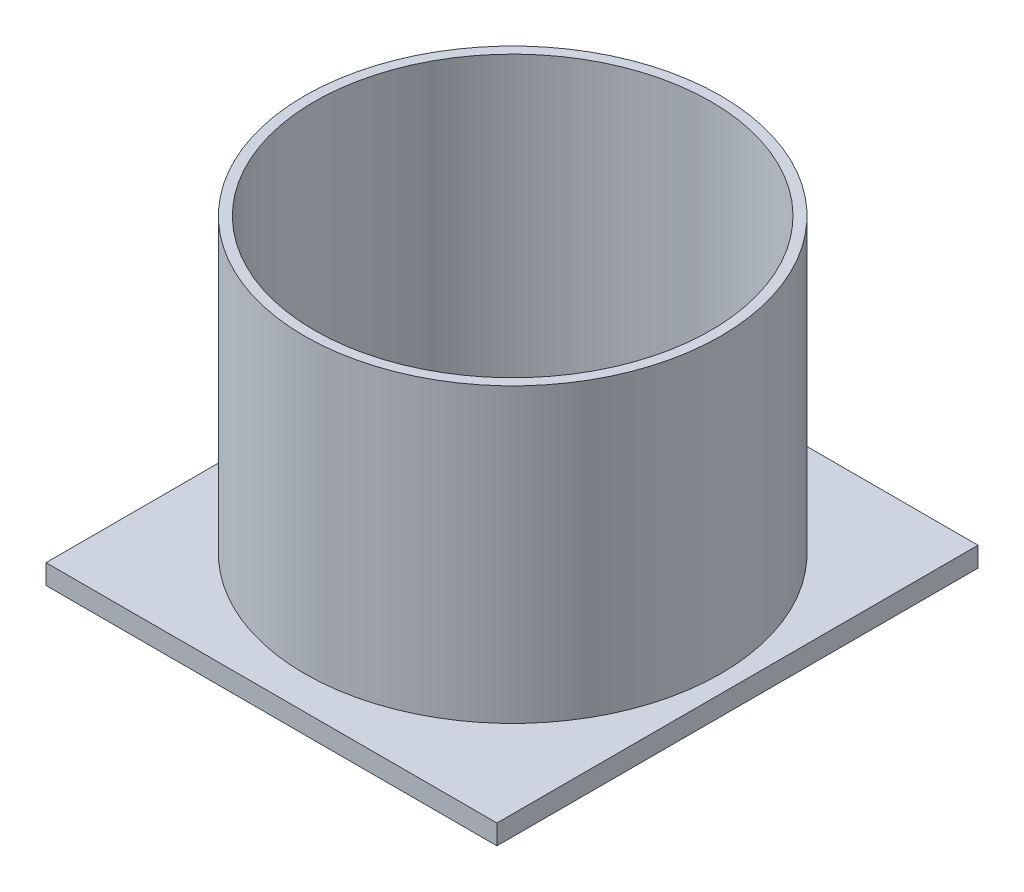
ISO-10303-21;
HEADER;
FILE_DESCRIPTION(('STEP AP214'),'2;1');
FILE_NAME('part.step','',(''),(''),'','','');
FILE_SCHEMA(('AUTOMOTIVE_DESIGN { 1 0 10303 214 1 1 1 1 }'));
ENDSEC;
DATA;
#1=APPLICATION_CONTEXT('core data for automotive mechanical design processes');
#2=APPLICATION_PROTOCOL_DEFINITION('international standard','automotive_design',2000,#1);
#3=PRODUCT_CONTEXT('',#1,'mechanical');
#4=PRODUCT('Part','Part','',(#3));
#5=PRODUCT_RELATED_PRODUCT_CATEGORY('part','',(#4));
#6=PRODUCT_DEFINITION_FORMATION('','',#4);
#7=PRODUCT_DEFINITION_CONTEXT('part definition',#1,'design');
#8=PRODUCT_DEFINITION('design','',#6,#7);
#9=PRODUCT_DEFINITION_SHAPE('','',#8);
#10=(LENGTH_UNIT() NAMED_UNIT(*) SI_UNIT(.MILLI.,.METRE.));
#11=(NAMED_UNIT(*) PLANE_ANGLE_UNIT() SI_UNIT($,.RADIAN.));
#12=(NAMED_UNIT(*) SI_UNIT($,.STERADIAN.) SOLID_ANGLE_UNIT());
#13=UNCERTAINTY_MEASURE_WITH_UNIT(LENGTH_MEASURE(1.E-05),#10,'distance_accuracy_value','');
#14=(GEOMETRIC_REPRESENTATION_CONTEXT(3) GLOBAL_UNCERTAINTY_ASSIGNED_CONTEXT((#13)) GLOBAL_UNIT_ASSIGNED_CONTEXT((#10,
#11,#12)) REPRESENTATION_CONTEXT('',''));
#15=CARTESIAN_POINT('',(0.,0.,0.));
#16=DIRECTION('',(0.,0.,1.));
#17=DIRECTION('',(1.,0.,0.));
#18=AXIS2_PLACEMENT_3D('',#15,#16,#17);
#19=CARTESIAN_POINT('',(0.,1.5,-44.4));
#20=DIRECTION('',(1.,0.,0.));
#21=DIRECTION('',(0.,0.,-1.));
#22=AXIS2_PLACEMENT_3D('',#19,#20,#21);
#23=PLANE('',#22);
#24=DIRECTION('',(0.,0.,1.));
#25=VECTOR('',#24,1.);
#26=CARTESIAN_POINT('',(0.,1.5,-44.4));
#27=LINE('',#26,#25);
#28=CARTESIAN_POINT('',(0.,1.5,-18.96928800417));
#29=VERTEX_POINT('',#28);
#30=CARTESIAN_POINT('',(0.,1.5,0.));
#31=VERTEX_POINT('',#30);
#32=EDGE_CURVE('E155',#29,#31,#27,.T.);
#33=ORIENTED_EDGE('',*,*,#32,.F.);
#34=DIRECTION('',(0.,-1.,0.));
#35=VECTOR('',#34,1.);
#36=CARTESIAN_POINT('',(0.,33.,-18.96928800417));
#37=LINE('',#36,#35);
#38=CARTESIAN_POINT('',(0.,0.,-18.96928800417));
#39=VERTEX_POINT('',#38);
#40=EDGE_CURVE('E58',#29,#39,#37,.T.);
#41=ORIENTED_EDGE('',*,*,#40,.T.);
#42=DIRECTION('',(0.,0.,1.));
#43=VECTOR('',#42,1.);
#44=CARTESIAN_POINT('',(0.,0.,-44.4));
#45=LINE('',#44,#43);
#46=CARTESIAN_POINT('',(0.,0.,0.));
#47=VERTEX_POINT('',#46);
#48=EDGE_CURVE('E174',#39,#47,#45,.T.);
#49=ORIENTED_EDGE('',*,*,#48,.T.);
#50=DIRECTION('',(0.,-1.,0.));
#51=VECTOR('',#50,1.);
#52=CARTESIAN_POINT('',(0.,1.5,0.));
#53=LINE('',#52,#51);
#54=EDGE_CURVE('E43',#31,#47,#53,.T.);
#55=ORIENTED_EDGE('',*,*,#54,.F.);
#56=EDGE_LOOP('',(#33,#41,#49,#55));
#57=FACE_BOUND('',#56,.T.);
#58=ADVANCED_FACE('F35',(#57),#23,.F.);
#59=CARTESIAN_POINT('',(41.5,1.5,0.));
#60=DIRECTION('',(-1.,0.,0.));
#61=DIRECTION('',(0.,0.,1.));
#62=AXIS2_PLACEMENT_3D('',#59,#60,#61);
#63=PLANE('',#62);
#64=DIRECTION('',(0.,0.,-1.));
#65=VECTOR('',#64,1.);
#66=CARTESIAN_POINT('',(41.5,1.5,0.));
#67=LINE('',#66,#65);
#68=CARTESIAN_POINT('',(41.5,1.5,-25.43071199583));
#69=VERTEX_POINT('',#68);
#70=CARTESIAN_POINT('',(41.5,1.5,-44.4));
#71=VERTEX_POINT('',#70);
#72=EDGE_CURVE('E139',#69,#71,#67,.T.);
#73=ORIENTED_EDGE('',*,*,#72,.F.);
#74=DIRECTION('',(0.,-1.,0.));
#75=VECTOR('',#74,1.);
#76=CARTESIAN_POINT('',(41.5,33.,-25.43071199583));
#77=LINE('',#76,#75);
#78=CARTESIAN_POINT('',(41.5,0.,-25.43071199583));
#79=VERTEX_POINT('',#78);
#80=EDGE_CURVE('E50',#69,#79,#77,.T.);
#81=ORIENTED_EDGE('',*,*,#80,.T.);
#82=DIRECTION('',(0.,0.,-1.));
#83=VECTOR('',#82,1.);
#84=CARTESIAN_POINT('',(41.5,0.,0.));
#85=LINE('',#84,#83);
#86=CARTESIAN_POINT('',(41.5,0.,-44.4));
#87=VERTEX_POINT('',#86);
#88=EDGE_CURVE('E137',#79,#87,#85,.T.);
#89=ORIENTED_EDGE('',*,*,#88,.T.);
#90=DIRECTION('',(0.,-1.,0.));
#91=VECTOR('',#90,1.);
#92=CARTESIAN_POINT('',(41.5,1.5,-44.4));
#93=LINE('',#92,#91);
#94=EDGE_CURVE('E159',#71,#87,#93,.T.);
#95=ORIENTED_EDGE('',*,*,#94,.F.);
#96=EDGE_LOOP('',(#73,#81,#89,#95));
#97=FACE_BOUND('',#96,.T.);
#98=ADVANCED_FACE('F135',(#97),#63,.F.);
#99=CARTESIAN_POINT('',(0.,0.,-44.4));
#100=VERTEX_POINT('',#99);
#101=CARTESIAN_POINT('',(0.,0.,-25.43071199583));
#102=VERTEX_POINT('',#101);
#103=EDGE_CURVE('E150',#100,#102,#45,.T.);
#104=ORIENTED_EDGE('',*,*,#103,.T.);
#105=DIRECTION('',(0.,-1.,0.));
#106=VECTOR('',#105,1.);
#107=CARTESIAN_POINT('',(0.,33.,-25.43071199583));
#108=LINE('',#107,#106);
#109=CARTESIAN_POINT('',(0.,1.5,-25.43071199583));
#110=VERTEX_POINT('',#109);
#111=EDGE_CURVE('E195',#102,#110,#108,.F.);
#112=ORIENTED_EDGE('',*,*,#111,.T.);
#113=CARTESIAN_POINT('',(0.,1.5,-44.4));
#114=VERTEX_POINT('',#113);
#115=EDGE_CURVE('E185',#114,#110,#27,.T.);
#116=ORIENTED_EDGE('',*,*,#115,.F.);
#117=DIRECTION('',(0.,-1.,0.));
#118=VECTOR('',#117,1.);
#119=CARTESIAN_POINT('',(0.,1.5,-44.4));
#120=LINE('',#119,#118);
#121=EDGE_CURVE('E156',#114,#100,#120,.T.);
#122=ORIENTED_EDGE('',*,*,#121,.T.);
#123=EDGE_LOOP('',(#104,#112,#116,#122));
#124=FACE_BOUND('',#123,.T.);
#125=ADVANCED_FACE('F37',(#124),#23,.F.);
#126=CARTESIAN_POINT('',(0.,1.5,0.));
#127=DIRECTION('',(0.,0.,-1.));
#128=DIRECTION('',(-1.,0.,0.));
#129=AXIS2_PLACEMENT_3D('',#126,#127,#128);
#130=PLANE('',#129);
#131=DIRECTION('',(1.,0.,0.));
#132=VECTOR('',#131,1.);
#133=CARTESIAN_POINT('',(0.,0.,0.));
#134=LINE('',#133,#132);
#135=CARTESIAN_POINT('',(41.5,0.,0.));
#136=VERTEX_POINT('',#135);
#137=EDGE_CURVE('E148',#47,#136,#134,.T.);
#138=ORIENTED_EDGE('',*,*,#137,.T.);
#139=DIRECTION('',(0.,-1.,0.));
#140=VECTOR('',#139,1.);
#141=CARTESIAN_POINT('',(41.5,1.5,0.));
#142=LINE('',#141,#140);
#143=CARTESIAN_POINT('',(41.5,1.5,0.));
#144=VERTEX_POINT('',#143);
#145=EDGE_CURVE('E162',#144,#136,#142,.T.);
#146=ORIENTED_EDGE('',*,*,#145,.F.);
#147=DIRECTION('',(1.,0.,0.));
#148=VECTOR('',#147,1.);
#149=CARTESIAN_POINT('',(0.,1.5,0.));
#150=LINE('',#149,#148);
#151=EDGE_CURVE('E171',#31,#144,#150,.T.);
#152=ORIENTED_EDGE('',*,*,#151,.F.);
#153=ORIENTED_EDGE('',*,*,#54,.T.);
#154=EDGE_LOOP('',(#138,#146,#152,#153));
#155=FACE_BOUND('',#154,.T.);
#156=ADVANCED_FACE('F168',(#155),#130,.F.);
#157=CARTESIAN_POINT('',(41.5,0.,-18.96928800417));
#158=VERTEX_POINT('',#157);
#159=EDGE_CURVE('E147',#136,#158,#85,.T.);
#160=ORIENTED_EDGE('',*,*,#159,.T.);
#161=DIRECTION('',(0.,-1.,0.));
#162=VECTOR('',#161,1.);
#163=CARTESIAN_POINT('',(41.5,33.,-18.96928800417));
#164=LINE('',#163,#162);
#165=CARTESIAN_POINT('',(41.5,1.5,-18.96928800417));
#166=VERTEX_POINT('',#165);
#167=EDGE_CURVE('E125',#158,#166,#164,.F.);
#168=ORIENTED_EDGE('',*,*,#167,.T.);
#169=EDGE_CURVE('E181',#144,#166,#67,.T.);
#170=ORIENTED_EDGE('',*,*,#169,.F.);
#171=ORIENTED_EDGE('',*,*,#145,.T.);
#172=EDGE_LOOP('',(#160,#168,#170,#171));
#173=FACE_BOUND('',#172,.T.);
#174=ADVANCED_FACE('F178',(#173),#63,.F.);
#175=CARTESIAN_POINT('',(41.5,1.5,-44.4));
#176=DIRECTION('',(0.,0.,1.));
#177=DIRECTION('',(1.,0.,0.));
#178=AXIS2_PLACEMENT_3D('',#175,#176,#177);
#179=PLANE('',#178);
#180=DIRECTION('',(-1.,0.,0.));
#181=VECTOR('',#180,1.);
#182=CARTESIAN_POINT('',(41.5,0.,-44.4));
#183=LINE('',#182,#181);
#184=EDGE_CURVE('E146',#87,#100,#183,.T.);
#185=ORIENTED_EDGE('',*,*,#184,.T.);
#186=ORIENTED_EDGE('',*,*,#121,.F.);
#187=DIRECTION('',(-1.,0.,0.));
#188=VECTOR('',#187,1.);
#189=CARTESIAN_POINT('',(41.5,1.5,-44.4));
#190=LINE('',#189,#188);
#191=EDGE_CURVE('E160',#71,#114,#190,.T.);
#192=ORIENTED_EDGE('',*,*,#191,.F.);
#193=ORIENTED_EDGE('',*,*,#94,.T.);
#194=EDGE_LOOP('',(#185,#186,#192,#193));
#195=FACE_BOUND('',#194,.T.);
#196=ADVANCED_FACE('F284',(#195),#179,.F.);
#197=CARTESIAN_POINT('',(0.,0.,0.));
#198=DIRECTION('',(0.,1.,0.));
#199=DIRECTION('',(0.,0.,1.));
#200=AXIS2_PLACEMENT_3D('',#197,#198,#199);
#201=PLANE('',#200);
#202=CARTESIAN_POINT('',(20.75,0.,-22.2));
#203=DIRECTION('',(0.,1.,0.));
#204=DIRECTION('',(0.,0.,1.));
#205=AXIS2_PLACEMENT_3D('',#202,#203,#204);
#206=CIRCLE('',#205,20.);
#207=CARTESIAN_POINT('',(20.75,0.,-2.20000000000001));
#208=VERTEX_POINT('',#207);
#209=EDGE_CURVE('E197',#208,#208,#206,.T.);
#210=ORIENTED_EDGE('',*,*,#209,.T.);
#211=EDGE_LOOP('',(#210));
#212=FACE_BOUND('',#211,.T.);
#213=ORIENTED_EDGE('',*,*,#48,.F.);
#214=CARTESIAN_POINT('',(20.75,0.,-22.2));
#215=DIRECTION('',(0.,-1.,0.));
#216=DIRECTION('',(0.,0.,-1.));
#217=AXIS2_PLACEMENT_3D('',#214,#215,#216);
#218=CIRCLE('',#217,21.);
#219=EDGE_CURVE('E131',#39,#102,#218,.T.);
#220=ORIENTED_EDGE('',*,*,#219,.T.);
#221=ORIENTED_EDGE('',*,*,#103,.F.);
#222=ORIENTED_EDGE('',*,*,#184,.F.);
#223=ORIENTED_EDGE('',*,*,#88,.F.);
#224=EDGE_CURVE('E122',#79,#158,#218,.T.);
#225=ORIENTED_EDGE('',*,*,#224,.T.);
#226=ORIENTED_EDGE('',*,*,#159,.F.);
#227=ORIENTED_EDGE('',*,*,#137,.F.);
#228=EDGE_LOOP('',(#213,#220,#221,#222,#223,#225,#226,#227));
#229=FACE_BOUND('',#228,.T.);
#230=ADVANCED_FACE('F144',(#212,#229),#201,.F.);
#231=CARTESIAN_POINT('',(0.,1.5,0.));
#232=DIRECTION('',(0.,1.,0.));
#233=DIRECTION('',(0.,0.,1.));
#234=AXIS2_PLACEMENT_3D('',#231,#232,#233);
#235=PLANE('',#234);
#236=DIRECTION('',(0.,0.,1.));
#237=VECTOR('',#236,1.);
#238=CARTESIAN_POINT('',(-2.,1.5,-46.4));
#239=LINE('',#238,#237);
#240=CARTESIAN_POINT('',(-2.,1.5,-46.4));
#241=VERTEX_POINT('',#240);
#242=CARTESIAN_POINT('',(-2.,1.5,2.13975903614458));
#243=VERTEX_POINT('',#242);
#244=EDGE_CURVE('E140',#241,#243,#239,.T.);
#245=ORIENTED_EDGE('',*,*,#244,.F.);
#246=DIRECTION('',(-1.,0.,0.));
#247=VECTOR('',#246,1.);
#248=CARTESIAN_POINT('',(43.5,1.5,-46.4));
#249=LINE('',#248,#247);
#250=CARTESIAN_POINT('',(43.5,1.5,-46.4));
#251=VERTEX_POINT('',#250);
#252=EDGE_CURVE('E214',#251,#241,#249,.T.);
#253=ORIENTED_EDGE('',*,*,#252,.F.);
#254=DIRECTION('',(0.,0.,-1.));
#255=VECTOR('',#254,1.);
#256=CARTESIAN_POINT('',(43.5,1.5,2.13975903614456));
#257=LINE('',#256,#255);
#258=CARTESIAN_POINT('',(43.5,1.5,2.13975903614456));
#259=VERTEX_POINT('',#258);
#260=EDGE_CURVE('E225',#259,#251,#257,.T.);
#261=ORIENTED_EDGE('',*,*,#260,.F.);
#262=DIRECTION('',(1.,0.,0.));
#263=VECTOR('',#262,1.);
#264=CARTESIAN_POINT('',(-2.,1.5,2.13975903614458));
#265=LINE('',#264,#263);
#266=EDGE_CURVE('E223',#243,#259,#265,.T.);
#267=ORIENTED_EDGE('',*,*,#266,.F.);
#268=EDGE_LOOP('',(#245,#253,#261,#267));
#269=FACE_BOUND('',#268,.T.);
#270=ORIENTED_EDGE('',*,*,#169,.T.);
#271=CARTESIAN_POINT('',(20.75,1.5,-22.2));
#272=DIRECTION('',(0.,1.,0.));
#273=DIRECTION('',(0.,0.,1.));
#274=AXIS2_PLACEMENT_3D('',#271,#272,#273);
#275=CIRCLE('',#274,21.);
#276=EDGE_CURVE('E206',#166,#69,#275,.T.);
#277=ORIENTED_EDGE('',*,*,#276,.T.);
#278=ORIENTED_EDGE('',*,*,#72,.T.);
#279=ORIENTED_EDGE('',*,*,#191,.T.);
#280=ORIENTED_EDGE('',*,*,#115,.T.);
#281=EDGE_CURVE('E204',#110,#29,#275,.T.);
#282=ORIENTED_EDGE('',*,*,#281,.T.);
#283=ORIENTED_EDGE('',*,*,#32,.T.);
#284=ORIENTED_EDGE('',*,*,#151,.T.);
#285=EDGE_LOOP('',(#270,#277,#278,#279,#280,#282,#283,#284));
#286=FACE_BOUND('',#285,.T.);
#287=ADVANCED_FACE('F184',(#269,#286),#235,.F.);
#288=CARTESIAN_POINT('',(-2.,3.5,-46.4));
#289=DIRECTION('',(1.,0.,0.));
#290=DIRECTION('',(0.,0.,-1.));
#291=AXIS2_PLACEMENT_3D('',#288,#289,#290);
#292=PLANE('',#291);
#293=ORIENTED_EDGE('',*,*,#244,.T.);
#294=DIRECTION('',(0.,-1.,0.));
#295=VECTOR('',#294,1.);
#296=CARTESIAN_POINT('',(-2.,3.5,2.13975903614458));
#297=LINE('',#296,#295);
#298=CARTESIAN_POINT('',(-2.,3.5,2.13975903614458));
#299=VERTEX_POINT('',#298);
#300=EDGE_CURVE('E176',#299,#243,#297,.T.);
#301=ORIENTED_EDGE('',*,*,#300,.F.);
#302=DIRECTION('',(0.,0.,1.));
#303=VECTOR('',#302,1.);
#304=CARTESIAN_POINT('',(-2.,3.5,-46.4));
#305=LINE('',#304,#303);
#306=CARTESIAN_POINT('',(-2.,3.5,-46.4));
#307=VERTEX_POINT('',#306);
#308=EDGE_CURVE('E210',#307,#299,#305,.T.);
#309=ORIENTED_EDGE('',*,*,#308,.F.);
#310=DIRECTION('',(0.,-1.,0.));
#311=VECTOR('',#310,1.);
#312=CARTESIAN_POINT('',(-2.,3.5,-46.4));
#313=LINE('',#312,#311);
#314=EDGE_CURVE('E220',#307,#241,#313,.T.);
#315=ORIENTED_EDGE('',*,*,#314,.T.);
#316=EDGE_LOOP('',(#293,#301,#309,#315));
#317=FACE_BOUND('',#316,.T.);
#318=ADVANCED_FACE('F243',(#317),#292,.F.);
#319=CARTESIAN_POINT('',(-2.,3.5,2.13975903614458));
#320=DIRECTION('',(0.,0.,-1.));
#321=DIRECTION('',(-1.,0.,0.));
#322=AXIS2_PLACEMENT_3D('',#319,#320,#321);
#323=PLANE('',#322);
#324=ORIENTED_EDGE('',*,*,#266,.T.);
#325=DIRECTION('',(0.,-1.,0.));
#326=VECTOR('',#325,1.);
#327=CARTESIAN_POINT('',(43.5,3.5,2.13975903614456));
#328=LINE('',#327,#326);
#329=CARTESIAN_POINT('',(43.5,3.5,2.13975903614456));
#330=VERTEX_POINT('',#329);
#331=EDGE_CURVE('E233',#330,#259,#328,.T.);
#332=ORIENTED_EDGE('',*,*,#331,.F.);
#333=DIRECTION('',(1.,0.,0.));
#334=VECTOR('',#333,1.);
#335=CARTESIAN_POINT('',(-2.,3.5,2.13975903614458));
#336=LINE('',#335,#334);
#337=EDGE_CURVE('E213',#299,#330,#336,.T.);
#338=ORIENTED_EDGE('',*,*,#337,.F.);
#339=ORIENTED_EDGE('',*,*,#300,.T.);
#340=EDGE_LOOP('',(#324,#332,#338,#339));
#341=FACE_BOUND('',#340,.T.);
#342=ADVANCED_FACE('F238',(#341),#323,.F.);
#343=CARTESIAN_POINT('',(43.5,3.5,2.13975903614456));
#344=DIRECTION('',(-1.,0.,0.));
#345=DIRECTION('',(0.,0.,1.));
#346=AXIS2_PLACEMENT_3D('',#343,#344,#345);
#347=PLANE('',#346);
#348=ORIENTED_EDGE('',*,*,#260,.T.);
#349=DIRECTION('',(0.,-1.,0.));
#350=VECTOR('',#349,1.);
#351=CARTESIAN_POINT('',(43.5,3.5,-46.4));
#352=LINE('',#351,#350);
#353=CARTESIAN_POINT('',(43.5,3.5,-46.4));
#354=VERTEX_POINT('',#353);
#355=EDGE_CURVE('E230',#354,#251,#352,.T.);
#356=ORIENTED_EDGE('',*,*,#355,.F.);
#357=DIRECTION('',(0.,0.,-1.));
#358=VECTOR('',#357,1.);
#359=CARTESIAN_POINT('',(43.5,3.5,2.13975903614456));
#360=LINE('',#359,#358);
#361=EDGE_CURVE('E216',#330,#354,#360,.T.);
#362=ORIENTED_EDGE('',*,*,#361,.F.);
#363=ORIENTED_EDGE('',*,*,#331,.T.);
#364=EDGE_LOOP('',(#348,#356,#362,#363));
#365=FACE_BOUND('',#364,.T.);
#366=ADVANCED_FACE('F250',(#365),#347,.F.);
#367=CARTESIAN_POINT('',(43.5,3.5,-46.4));
#368=DIRECTION('',(0.,0.,1.));
#369=DIRECTION('',(1.,0.,0.));
#370=AXIS2_PLACEMENT_3D('',#367,#368,#369);
#371=PLANE('',#370);
#372=ORIENTED_EDGE('',*,*,#252,.T.);
#373=ORIENTED_EDGE('',*,*,#314,.F.);
#374=DIRECTION('',(-1.,0.,0.));
#375=VECTOR('',#374,1.);
#376=CARTESIAN_POINT('',(43.5,3.5,-46.4));
#377=LINE('',#376,#375);
#378=EDGE_CURVE('E218',#354,#307,#377,.T.);
#379=ORIENTED_EDGE('',*,*,#378,.F.);
#380=ORIENTED_EDGE('',*,*,#355,.T.);
#381=EDGE_LOOP('',(#372,#373,#379,#380));
#382=FACE_BOUND('',#381,.T.);
#383=ADVANCED_FACE('F254',(#382),#371,.F.);
#384=CARTESIAN_POINT('',(0.,3.5,0.));
#385=DIRECTION('',(0.,1.,0.));
#386=DIRECTION('',(0.,0.,1.));
#387=AXIS2_PLACEMENT_3D('',#384,#385,#386);
#388=PLANE('',#387);
#389=CARTESIAN_POINT('',(20.75,3.5,-22.2));
#390=DIRECTION('',(0.,1.,0.));
#391=DIRECTION('',(0.,0.,1.));
#392=AXIS2_PLACEMENT_3D('',#389,#390,#391);
#393=CIRCLE('',#392,21.);
#394=CARTESIAN_POINT('',(20.75,3.5,-1.20000000000001));
#395=VERTEX_POINT('',#394);
#396=EDGE_CURVE('E11',#395,#395,#393,.T.);
#397=ORIENTED_EDGE('',*,*,#396,.F.);
#398=EDGE_LOOP('',(#397));
#399=FACE_BOUND('',#398,.T.);
#400=ORIENTED_EDGE('',*,*,#308,.T.);
#401=ORIENTED_EDGE('',*,*,#337,.T.);
#402=ORIENTED_EDGE('',*,*,#361,.T.);
#403=ORIENTED_EDGE('',*,*,#378,.T.);
#404=EDGE_LOOP('',(#400,#401,#402,#403));
#405=FACE_BOUND('',#404,.T.);
#406=ADVANCED_FACE('F256',(#399,#405),#388,.T.);
#407=CARTESIAN_POINT('',(20.75,33.,-22.2));
#408=DIRECTION('',(0.,-1.,0.));
#409=DIRECTION('',(0.,0.,-1.));
#410=AXIS2_PLACEMENT_3D('',#407,#408,#409);
#411=PLANE('',#410);
#412=CARTESIAN_POINT('',(20.75,33.,-22.2));
#413=DIRECTION('',(0.,1.,0.));
#414=DIRECTION('',(0.,0.,1.));
#415=AXIS2_PLACEMENT_3D('',#412,#413,#414);
#416=CIRCLE('',#415,20.);
#417=CARTESIAN_POINT('',(20.75,33.,-2.20000000000001));
#418=VERTEX_POINT('',#417);
#419=EDGE_CURVE('E199',#418,#418,#416,.T.);
#420=ORIENTED_EDGE('',*,*,#419,.F.);
#421=EDGE_LOOP('',(#420));
#422=FACE_BOUND('',#421,.T.);
#423=CARTESIAN_POINT('',(20.75,33.,-22.2));
#424=DIRECTION('',(0.,-1.,0.));
#425=DIRECTION('',(0.,0.,-1.));
#426=AXIS2_PLACEMENT_3D('',#423,#424,#425);
#427=CIRCLE('',#426,21.);
#428=CARTESIAN_POINT('',(20.75,33.,-43.2));
#429=VERTEX_POINT('',#428);
#430=EDGE_CURVE('E130',#429,#429,#427,.T.);
#431=ORIENTED_EDGE('',*,*,#430,.F.);
#432=EDGE_LOOP('',(#431));
#433=FACE_BOUND('',#432,.T.);
#434=ADVANCED_FACE('F258',(#422,#433),#411,.F.);
#435=CARTESIAN_POINT('',(20.75,33.,-22.2));
#436=DIRECTION('',(0.,-1.,0.));
#437=DIRECTION('',(0.,0.,-1.));
#438=AXIS2_PLACEMENT_3D('',#435,#436,#437);
#439=CYLINDRICAL_SURFACE('',#438,21.);
#440=ORIENTED_EDGE('',*,*,#396,.T.);
#441=EDGE_LOOP('',(#440));
#442=FACE_BOUND('',#441,.T.);
#443=ORIENTED_EDGE('',*,*,#430,.T.);
#444=EDGE_LOOP('',(#443));
#445=FACE_BOUND('',#444,.T.);
#446=ADVANCED_FACE('F265',(#442,#445),#439,.T.);
#447=ORIENTED_EDGE('',*,*,#40,.F.);
#448=ORIENTED_EDGE('',*,*,#281,.F.);
#449=ORIENTED_EDGE('',*,*,#111,.F.);
#450=ORIENTED_EDGE('',*,*,#219,.F.);
#451=EDGE_LOOP('',(#447,#448,#449,#450));
#452=FACE_BOUND('',#451,.T.);
#453=ADVANCED_FACE('F381',(#452),#439,.T.);
#454=ORIENTED_EDGE('',*,*,#80,.F.);
#455=ORIENTED_EDGE('',*,*,#276,.F.);
#456=ORIENTED_EDGE('',*,*,#167,.F.);
#457=ORIENTED_EDGE('',*,*,#224,.F.);
#458=EDGE_LOOP('',(#454,#455,#456,#457));
#459=FACE_BOUND('',#458,.T.);
#460=ADVANCED_FACE('F123',(#459),#439,.T.);
#461=CARTESIAN_POINT('',(20.75,0.,-22.2));
#462=DIRECTION('',(0.,1.,0.));
#463=DIRECTION('',(0.,0.,1.));
#464=AXIS2_PLACEMENT_3D('',#461,#462,#463);
#465=CYLINDRICAL_SURFACE('',#464,20.);
#466=ORIENTED_EDGE('',*,*,#209,.F.);
#467=EDGE_LOOP('',(#466));
#468=FACE_BOUND('',#467,.T.);
#469=ORIENTED_EDGE('',*,*,#419,.T.);
#470=EDGE_LOOP('',(#469));
#471=FACE_BOUND('',#470,.T.);
#472=ADVANCED_FACE('F394',(#468,#471),#465,.F.);
#473=CLOSED_SHELL('',(#58,#98,#125,#156,#174,#196,#230,#287,#318,#342,#366,#383,#406,#434,#446,
#453,#460,#472));
#474=MANIFOLD_SOLID_BREP('B2',#473);
#475=ADVANCED_BREP_SHAPE_REPRESENTATION('',(#18,#474),#14);
#476=SHAPE_DEFINITION_REPRESENTATION(#9,#475);
ENDSEC;
END-ISO-10303-21;
